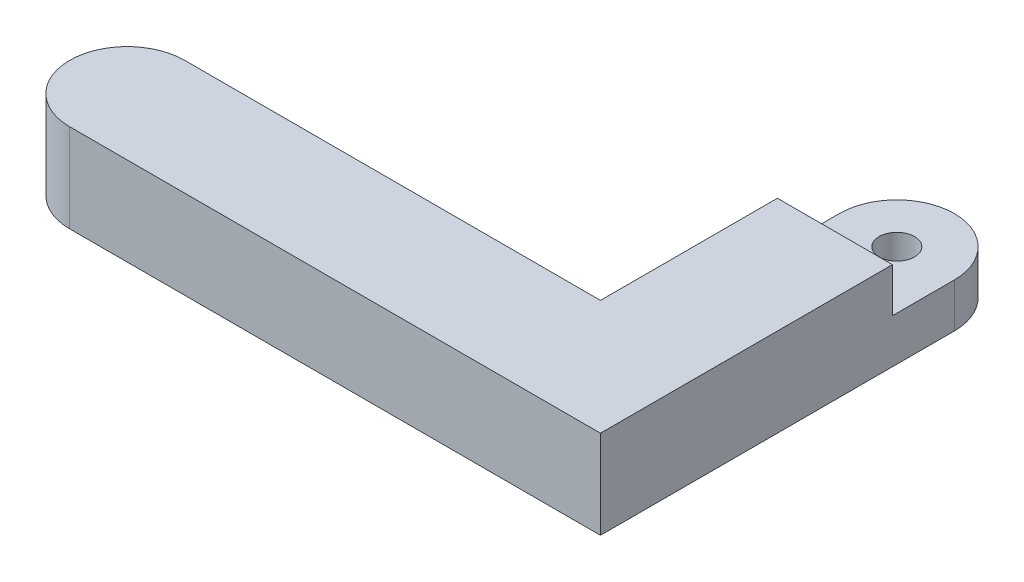
ISO-10303-21;
HEADER;
FILE_DESCRIPTION(('STEP AP214'),'2;1');
FILE_NAME('part.step','',(''),(''),'','','');
FILE_SCHEMA(('AUTOMOTIVE_DESIGN { 1 0 10303 214 1 1 1 1 }'));
ENDSEC;
DATA;
#1=APPLICATION_CONTEXT('core data for automotive mechanical design processes');
#2=APPLICATION_PROTOCOL_DEFINITION('international standard','automotive_design',2000,#1);
#3=PRODUCT_CONTEXT('',#1,'mechanical');
#4=PRODUCT('Part','Part','',(#3));
#5=PRODUCT_RELATED_PRODUCT_CATEGORY('part','',(#4));
#6=PRODUCT_DEFINITION_FORMATION('','',#4);
#7=PRODUCT_DEFINITION_CONTEXT('part definition',#1,'design');
#8=PRODUCT_DEFINITION('design','',#6,#7);
#9=PRODUCT_DEFINITION_SHAPE('','',#8);
#10=(LENGTH_UNIT() NAMED_UNIT(*) SI_UNIT(.MILLI.,.METRE.));
#11=(NAMED_UNIT(*) PLANE_ANGLE_UNIT() SI_UNIT($,.RADIAN.));
#12=(NAMED_UNIT(*) SI_UNIT($,.STERADIAN.) SOLID_ANGLE_UNIT());
#13=UNCERTAINTY_MEASURE_WITH_UNIT(LENGTH_MEASURE(1.E-05),#10,'distance_accuracy_value','');
#14=(GEOMETRIC_REPRESENTATION_CONTEXT(3) GLOBAL_UNCERTAINTY_ASSIGNED_CONTEXT((#13)) GLOBAL_UNIT_ASSIGNED_CONTEXT((#10,
#11,#12)) REPRESENTATION_CONTEXT('',''));
#15=CARTESIAN_POINT('',(0.,0.,0.));
#16=DIRECTION('',(0.,0.,1.));
#17=DIRECTION('',(1.,0.,0.));
#18=AXIS2_PLACEMENT_3D('',#15,#16,#17);
#19=CARTESIAN_POINT('',(6.5,10.,0.));
#20=DIRECTION('',(0.,-1.,0.));
#21=DIRECTION('',(0.,0.,-1.));
#22=AXIS2_PLACEMENT_3D('',#19,#20,#21);
#23=CYLINDRICAL_SURFACE('',#22,6.5);
#24=CARTESIAN_POINT('',(6.5,5.,0.));
#25=DIRECTION('',(0.,1.,0.));
#26=DIRECTION('',(0.,0.,1.));
#27=AXIS2_PLACEMENT_3D('',#24,#25,#26);
#28=CIRCLE('',#27,6.5);
#29=CARTESIAN_POINT('',(13.,5.,0.));
#30=VERTEX_POINT('',#29);
#31=CARTESIAN_POINT('',(0.,5.,0.));
#32=VERTEX_POINT('',#31);
#33=EDGE_CURVE('E114',#30,#32,#28,.T.);
#34=ORIENTED_EDGE('',*,*,#33,.F.);
#35=DIRECTION('',(0.,-1.,0.));
#36=VECTOR('',#35,1.);
#37=CARTESIAN_POINT('',(13.,10.,0.));
#38=LINE('',#37,#36);
#39=CARTESIAN_POINT('',(13.,0.,0.));
#40=VERTEX_POINT('',#39);
#41=EDGE_CURVE('E93',#30,#40,#38,.T.);
#42=ORIENTED_EDGE('',*,*,#41,.T.);
#43=CARTESIAN_POINT('',(6.5,0.,0.));
#44=DIRECTION('',(0.,1.,0.));
#45=DIRECTION('',(0.,0.,-1.));
#46=AXIS2_PLACEMENT_3D('',#43,#44,#45);
#47=CIRCLE('',#46,6.5);
#48=CARTESIAN_POINT('',(0.,0.,0.));
#49=VERTEX_POINT('',#48);
#50=EDGE_CURVE('E132',#40,#49,#47,.T.);
#51=ORIENTED_EDGE('',*,*,#50,.T.);
#52=DIRECTION('',(0.,-1.,0.));
#53=VECTOR('',#52,1.);
#54=CARTESIAN_POINT('',(0.,10.,0.));
#55=LINE('',#54,#53);
#56=EDGE_CURVE('E11',#32,#49,#55,.T.);
#57=ORIENTED_EDGE('',*,*,#56,.F.);
#58=EDGE_LOOP('',(#34,#42,#51,#57));
#59=FACE_BOUND('',#58,.T.);
#60=ADVANCED_FACE('F42',(#59),#23,.T.);
#61=CARTESIAN_POINT('',(6.5,10.,0.));
#62=DIRECTION('',(0.,-1.,0.));
#63=DIRECTION('',(0.,0.,-1.));
#64=AXIS2_PLACEMENT_3D('',#61,#62,#63);
#65=CYLINDRICAL_SURFACE('',#64,2.);
#66=CARTESIAN_POINT('',(6.5,0.,0.));
#67=DIRECTION('',(0.,1.,0.));
#68=DIRECTION('',(0.,0.,1.));
#69=AXIS2_PLACEMENT_3D('',#66,#67,#68);
#70=CIRCLE('',#69,2.);
#71=CARTESIAN_POINT('',(6.5,0.,2.));
#72=VERTEX_POINT('',#71);
#73=EDGE_CURVE('E137',#72,#72,#70,.T.);
#74=ORIENTED_EDGE('',*,*,#73,.F.);
#75=EDGE_LOOP('',(#74));
#76=FACE_BOUND('',#75,.T.);
#77=CARTESIAN_POINT('',(6.5,5.,0.));
#78=DIRECTION('',(0.,1.,0.));
#79=DIRECTION('',(0.,0.,1.));
#80=AXIS2_PLACEMENT_3D('',#77,#78,#79);
#81=CIRCLE('',#80,2.);
#82=CARTESIAN_POINT('',(6.5,5.,2.));
#83=VERTEX_POINT('',#82);
#84=EDGE_CURVE('E210',#83,#83,#81,.T.);
#85=ORIENTED_EDGE('',*,*,#84,.T.);
#86=EDGE_LOOP('',(#85));
#87=FACE_BOUND('',#86,.T.);
#88=ADVANCED_FACE('F219',(#76,#87),#65,.F.);
#89=CARTESIAN_POINT('',(6.5,10.,0.));
#90=DIRECTION('',(0.,-1.,0.));
#91=DIRECTION('',(0.,0.,-1.));
#92=AXIS2_PLACEMENT_3D('',#89,#90,#91);
#93=PLANE('',#92);
#94=DIRECTION('',(0.,0.,-1.));
#95=VECTOR('',#94,1.);
#96=CARTESIAN_POINT('',(13.,10.,0.));
#97=LINE('',#96,#95);
#98=CARTESIAN_POINT('',(13.,10.,40.));
#99=VERTEX_POINT('',#98);
#100=CARTESIAN_POINT('',(13.,10.,7.));
#101=VERTEX_POINT('',#100);
#102=EDGE_CURVE('E147',#99,#101,#97,.T.);
#103=ORIENTED_EDGE('',*,*,#102,.T.);
#104=DIRECTION('',(1.,0.,0.));
#105=VECTOR('',#104,1.);
#106=CARTESIAN_POINT('',(0.,10.,7.));
#107=LINE('',#106,#105);
#108=CARTESIAN_POINT('',(0.,10.,7.));
#109=VERTEX_POINT('',#108);
#110=EDGE_CURVE('E123',#109,#101,#107,.T.);
#111=ORIENTED_EDGE('',*,*,#110,.F.);
#112=DIRECTION('',(0.,0.,1.));
#113=VECTOR('',#112,1.);
#114=CARTESIAN_POINT('',(0.,10.,27.));
#115=LINE('',#114,#113);
#116=CARTESIAN_POINT('',(0.,10.,27.));
#117=VERTEX_POINT('',#116);
#118=EDGE_CURVE('E100',#109,#117,#115,.T.);
#119=ORIENTED_EDGE('',*,*,#118,.T.);
#120=DIRECTION('',(-1.,0.,0.));
#121=VECTOR('',#120,1.);
#122=CARTESIAN_POINT('',(-47.,10.,27.));
#123=LINE('',#122,#121);
#124=CARTESIAN_POINT('',(-47.,10.,27.));
#125=VERTEX_POINT('',#124);
#126=EDGE_CURVE('E181',#117,#125,#123,.T.);
#127=ORIENTED_EDGE('',*,*,#126,.T.);
#128=CARTESIAN_POINT('',(-47.,10.,33.5));
#129=DIRECTION('',(0.,1.,0.));
#130=DIRECTION('',(0.,0.,1.));
#131=AXIS2_PLACEMENT_3D('',#128,#129,#130);
#132=CIRCLE('',#131,6.49999999999999);
#133=CARTESIAN_POINT('',(-47.,10.,40.));
#134=VERTEX_POINT('',#133);
#135=EDGE_CURVE('E194',#125,#134,#132,.T.);
#136=ORIENTED_EDGE('',*,*,#135,.T.);
#137=DIRECTION('',(1.,0.,0.));
#138=VECTOR('',#137,1.);
#139=CARTESIAN_POINT('',(13.,10.,40.));
#140=LINE('',#139,#138);
#141=EDGE_CURVE('E66',#134,#99,#140,.T.);
#142=ORIENTED_EDGE('',*,*,#141,.T.);
#143=EDGE_LOOP('',(#103,#111,#119,#127,#136,#142));
#144=FACE_BOUND('',#143,.T.);
#145=ADVANCED_FACE('F234',(#144),#93,.F.);
#146=CARTESIAN_POINT('',(6.5,0.,0.));
#147=DIRECTION('',(0.,-1.,0.));
#148=DIRECTION('',(0.,0.,-1.));
#149=AXIS2_PLACEMENT_3D('',#146,#147,#148);
#150=PLANE('',#149);
#151=ORIENTED_EDGE('',*,*,#50,.F.);
#152=DIRECTION('',(0.,0.,-1.));
#153=VECTOR('',#152,1.);
#154=CARTESIAN_POINT('',(13.,0.,0.));
#155=LINE('',#154,#153);
#156=CARTESIAN_POINT('',(13.,0.,40.));
#157=VERTEX_POINT('',#156);
#158=EDGE_CURVE('E158',#157,#40,#155,.T.);
#159=ORIENTED_EDGE('',*,*,#158,.F.);
#160=DIRECTION('',(1.,0.,0.));
#161=VECTOR('',#160,1.);
#162=CARTESIAN_POINT('',(13.,0.,40.));
#163=LINE('',#162,#161);
#164=CARTESIAN_POINT('',(-47.,0.,40.));
#165=VERTEX_POINT('',#164);
#166=EDGE_CURVE('E155',#165,#157,#163,.T.);
#167=ORIENTED_EDGE('',*,*,#166,.F.);
#168=CARTESIAN_POINT('',(-47.,0.,33.5));
#169=DIRECTION('',(0.,1.,0.));
#170=DIRECTION('',(0.,0.,1.));
#171=AXIS2_PLACEMENT_3D('',#168,#169,#170);
#172=CIRCLE('',#171,6.49999999999999);
#173=CARTESIAN_POINT('',(-47.,0.,27.));
#174=VERTEX_POINT('',#173);
#175=EDGE_CURVE('E152',#174,#165,#172,.T.);
#176=ORIENTED_EDGE('',*,*,#175,.F.);
#177=DIRECTION('',(-1.,0.,0.));
#178=VECTOR('',#177,1.);
#179=CARTESIAN_POINT('',(-47.,0.,27.));
#180=LINE('',#179,#178);
#181=CARTESIAN_POINT('',(0.,0.,27.));
#182=VERTEX_POINT('',#181);
#183=EDGE_CURVE('E141',#182,#174,#180,.T.);
#184=ORIENTED_EDGE('',*,*,#183,.F.);
#185=DIRECTION('',(0.,0.,1.));
#186=VECTOR('',#185,1.);
#187=CARTESIAN_POINT('',(0.,0.,27.));
#188=LINE('',#187,#186);
#189=EDGE_CURVE('E136',#49,#182,#188,.T.);
#190=ORIENTED_EDGE('',*,*,#189,.F.);
#191=EDGE_LOOP('',(#151,#159,#167,#176,#184,#190));
#192=FACE_BOUND('',#191,.T.);
#193=ORIENTED_EDGE('',*,*,#73,.T.);
#194=EDGE_LOOP('',(#193));
#195=FACE_BOUND('',#194,.T.);
#196=ADVANCED_FACE('F183',(#192,#195),#150,.T.);
#197=CARTESIAN_POINT('',(0.,10.,27.));
#198=DIRECTION('',(1.,0.,0.));
#199=DIRECTION('',(0.,0.,-1.));
#200=AXIS2_PLACEMENT_3D('',#197,#198,#199);
#201=PLANE('',#200);
#202=ORIENTED_EDGE('',*,*,#118,.F.);
#203=DIRECTION('',(0.,1.,0.));
#204=VECTOR('',#203,1.);
#205=CARTESIAN_POINT('',(0.,5.,7.));
#206=LINE('',#205,#204);
#207=CARTESIAN_POINT('',(0.,5.,7.));
#208=VERTEX_POINT('',#207);
#209=EDGE_CURVE('E128',#208,#109,#206,.T.);
#210=ORIENTED_EDGE('',*,*,#209,.F.);
#211=DIRECTION('',(0.,0.,1.));
#212=VECTOR('',#211,1.);
#213=CARTESIAN_POINT('',(0.,5.,0.));
#214=LINE('',#213,#212);
#215=EDGE_CURVE('E117',#32,#208,#214,.T.);
#216=ORIENTED_EDGE('',*,*,#215,.F.);
#217=ORIENTED_EDGE('',*,*,#56,.T.);
#218=ORIENTED_EDGE('',*,*,#189,.T.);
#219=DIRECTION('',(0.,-1.,0.));
#220=VECTOR('',#219,1.);
#221=CARTESIAN_POINT('',(0.,10.,27.));
#222=LINE('',#221,#220);
#223=EDGE_CURVE('E50',#117,#182,#222,.T.);
#224=ORIENTED_EDGE('',*,*,#223,.F.);
#225=EDGE_LOOP('',(#202,#210,#216,#217,#218,#224));
#226=FACE_BOUND('',#225,.T.);
#227=ADVANCED_FACE('F126',(#226),#201,.F.);
#228=CARTESIAN_POINT('',(-47.,10.,27.));
#229=DIRECTION('',(0.,0.,1.));
#230=DIRECTION('',(1.,0.,0.));
#231=AXIS2_PLACEMENT_3D('',#228,#229,#230);
#232=PLANE('',#231);
#233=ORIENTED_EDGE('',*,*,#183,.T.);
#234=DIRECTION('',(0.,-1.,0.));
#235=VECTOR('',#234,1.);
#236=CARTESIAN_POINT('',(-47.,10.,27.));
#237=LINE('',#236,#235);
#238=EDGE_CURVE('E171',#125,#174,#237,.T.);
#239=ORIENTED_EDGE('',*,*,#238,.F.);
#240=ORIENTED_EDGE('',*,*,#126,.F.);
#241=ORIENTED_EDGE('',*,*,#223,.T.);
#242=EDGE_LOOP('',(#233,#239,#240,#241));
#243=FACE_BOUND('',#242,.T.);
#244=ADVANCED_FACE('F179',(#243),#232,.F.);
#245=CARTESIAN_POINT('',(-47.,10.,33.5));
#246=DIRECTION('',(0.,-1.,0.));
#247=DIRECTION('',(0.,0.,-1.));
#248=AXIS2_PLACEMENT_3D('',#245,#246,#247);
#249=CYLINDRICAL_SURFACE('',#248,6.49999999999999);
#250=ORIENTED_EDGE('',*,*,#175,.T.);
#251=DIRECTION('',(0.,-1.,0.));
#252=VECTOR('',#251,1.);
#253=CARTESIAN_POINT('',(-47.,10.,40.));
#254=LINE('',#253,#252);
#255=EDGE_CURVE('E167',#134,#165,#254,.T.);
#256=ORIENTED_EDGE('',*,*,#255,.F.);
#257=ORIENTED_EDGE('',*,*,#135,.F.);
#258=ORIENTED_EDGE('',*,*,#238,.T.);
#259=EDGE_LOOP('',(#250,#256,#257,#258));
#260=FACE_BOUND('',#259,.T.);
#261=ADVANCED_FACE('F188',(#260),#249,.T.);
#262=CARTESIAN_POINT('',(13.,10.,40.));
#263=DIRECTION('',(0.,0.,-1.));
#264=DIRECTION('',(-1.,0.,0.));
#265=AXIS2_PLACEMENT_3D('',#262,#263,#264);
#266=PLANE('',#265);
#267=ORIENTED_EDGE('',*,*,#166,.T.);
#268=DIRECTION('',(0.,-1.,0.));
#269=VECTOR('',#268,1.);
#270=CARTESIAN_POINT('',(13.,10.,40.));
#271=LINE('',#270,#269);
#272=EDGE_CURVE('E163',#99,#157,#271,.T.);
#273=ORIENTED_EDGE('',*,*,#272,.F.);
#274=ORIENTED_EDGE('',*,*,#141,.F.);
#275=ORIENTED_EDGE('',*,*,#255,.T.);
#276=EDGE_LOOP('',(#267,#273,#274,#275));
#277=FACE_BOUND('',#276,.T.);
#278=ADVANCED_FACE('F191',(#277),#266,.F.);
#279=CARTESIAN_POINT('',(13.,10.,0.));
#280=DIRECTION('',(-1.,0.,0.));
#281=DIRECTION('',(0.,0.,1.));
#282=AXIS2_PLACEMENT_3D('',#279,#280,#281);
#283=PLANE('',#282);
#284=DIRECTION('',(0.,0.,-1.));
#285=VECTOR('',#284,1.);
#286=CARTESIAN_POINT('',(13.,5.,7.));
#287=LINE('',#286,#285);
#288=CARTESIAN_POINT('',(13.,5.,7.));
#289=VERTEX_POINT('',#288);
#290=EDGE_CURVE('E120',#289,#30,#287,.T.);
#291=ORIENTED_EDGE('',*,*,#290,.F.);
#292=DIRECTION('',(0.,1.,0.));
#293=VECTOR('',#292,1.);
#294=CARTESIAN_POINT('',(13.,5.,7.));
#295=LINE('',#294,#293);
#296=EDGE_CURVE('E144',#289,#101,#295,.T.);
#297=ORIENTED_EDGE('',*,*,#296,.T.);
#298=ORIENTED_EDGE('',*,*,#102,.F.);
#299=ORIENTED_EDGE('',*,*,#272,.T.);
#300=ORIENTED_EDGE('',*,*,#158,.T.);
#301=ORIENTED_EDGE('',*,*,#41,.F.);
#302=EDGE_LOOP('',(#291,#297,#298,#299,#300,#301));
#303=FACE_BOUND('',#302,.T.);
#304=ADVANCED_FACE('F227',(#303),#283,.F.);
#305=CARTESIAN_POINT('',(0.,5.,7.));
#306=DIRECTION('',(0.,0.,1.));
#307=DIRECTION('',(1.,0.,0.));
#308=AXIS2_PLACEMENT_3D('',#305,#306,#307);
#309=PLANE('',#308);
#310=ORIENTED_EDGE('',*,*,#110,.T.);
#311=ORIENTED_EDGE('',*,*,#296,.F.);
#312=DIRECTION('',(1.,0.,0.));
#313=VECTOR('',#312,1.);
#314=CARTESIAN_POINT('',(0.,5.,7.));
#315=LINE('',#314,#313);
#316=EDGE_CURVE('E57',#208,#289,#315,.T.);
#317=ORIENTED_EDGE('',*,*,#316,.F.);
#318=ORIENTED_EDGE('',*,*,#209,.T.);
#319=EDGE_LOOP('',(#310,#311,#317,#318));
#320=FACE_BOUND('',#319,.T.);
#321=ADVANCED_FACE('F222',(#320),#309,.F.);
#322=CARTESIAN_POINT('',(6.5,5.,0.));
#323=DIRECTION('',(0.,1.,0.));
#324=DIRECTION('',(0.,0.,1.));
#325=AXIS2_PLACEMENT_3D('',#322,#323,#324);
#326=PLANE('',#325);
#327=ORIENTED_EDGE('',*,*,#84,.F.);
#328=EDGE_LOOP('',(#327));
#329=FACE_BOUND('',#328,.T.);
#330=ORIENTED_EDGE('',*,*,#33,.T.);
#331=ORIENTED_EDGE('',*,*,#215,.T.);
#332=ORIENTED_EDGE('',*,*,#316,.T.);
#333=ORIENTED_EDGE('',*,*,#290,.T.);
#334=EDGE_LOOP('',(#330,#331,#332,#333));
#335=FACE_BOUND('',#334,.T.);
#336=ADVANCED_FACE('F116',(#329,#335),#326,.T.);
#337=CLOSED_SHELL('',(#60,#88,#145,#196,#227,#244,#261,#278,#304,#321,#336));
#338=MANIFOLD_SOLID_BREP('B2',#337);
#339=ADVANCED_BREP_SHAPE_REPRESENTATION('',(#18,#338),#14);
#340=SHAPE_DEFINITION_REPRESENTATION(#9,#339);
ENDSEC;
END-ISO-10303-21;
